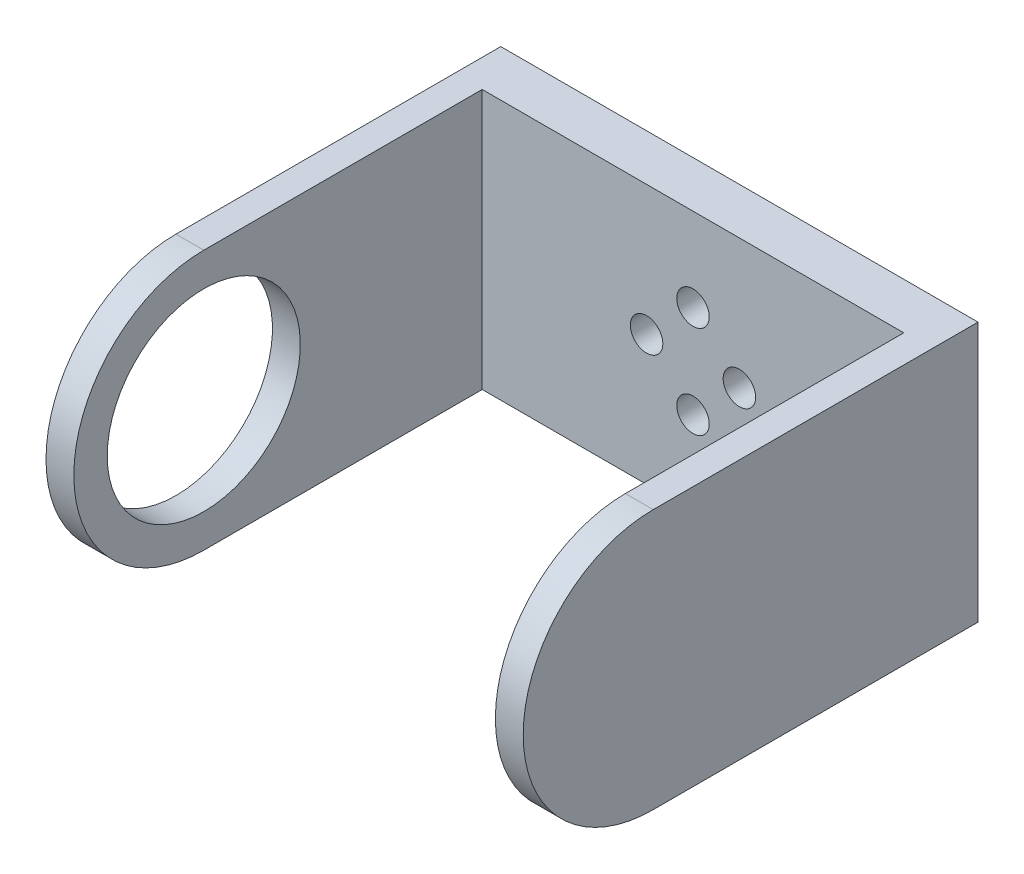
ISO-10303-21;
HEADER;
FILE_DESCRIPTION(('STEP AP214'),'2;1');
FILE_NAME('part.step','',(''),(''),'','','');
FILE_SCHEMA(('AUTOMOTIVE_DESIGN { 1 0 10303 214 1 1 1 1 }'));
ENDSEC;
DATA;
#1=APPLICATION_CONTEXT('core data for automotive mechanical design processes');
#2=APPLICATION_PROTOCOL_DEFINITION('international standard','automotive_design',2000,#1);
#3=PRODUCT_CONTEXT('',#1,'mechanical');
#4=PRODUCT('Part','Part','',(#3));
#5=PRODUCT_RELATED_PRODUCT_CATEGORY('part','',(#4));
#6=PRODUCT_DEFINITION_FORMATION('','',#4);
#7=PRODUCT_DEFINITION_CONTEXT('part definition',#1,'design');
#8=PRODUCT_DEFINITION('design','',#6,#7);
#9=PRODUCT_DEFINITION_SHAPE('','',#8);
#10=(LENGTH_UNIT() NAMED_UNIT(*) SI_UNIT(.MILLI.,.METRE.));
#11=(NAMED_UNIT(*) PLANE_ANGLE_UNIT() SI_UNIT($,.RADIAN.));
#12=(NAMED_UNIT(*) SI_UNIT($,.STERADIAN.) SOLID_ANGLE_UNIT());
#13=UNCERTAINTY_MEASURE_WITH_UNIT(LENGTH_MEASURE(1.E-05),#10,'distance_accuracy_value','');
#14=(GEOMETRIC_REPRESENTATION_CONTEXT(3) GLOBAL_UNCERTAINTY_ASSIGNED_CONTEXT((#13)) GLOBAL_UNIT_ASSIGNED_CONTEXT((#10,
#11,#12)) REPRESENTATION_CONTEXT('',''));
#15=CARTESIAN_POINT('',(0.,0.,0.));
#16=DIRECTION('',(0.,0.,1.));
#17=DIRECTION('',(1.,0.,0.));
#18=AXIS2_PLACEMENT_3D('',#15,#16,#17);
#19=CARTESIAN_POINT('',(25.71,14.,5.));
#20=DIRECTION('',(-1.,0.,0.));
#21=DIRECTION('',(0.,-1.,0.));
#22=AXIS2_PLACEMENT_3D('',#19,#20,#21);
#23=PLANE('',#22);
#24=DIRECTION('',(0.,1.,0.));
#25=VECTOR('',#24,1.);
#26=CARTESIAN_POINT('',(25.71,14.,0.));
#27=LINE('',#26,#25);
#28=CARTESIAN_POINT('',(25.71,-14.,0.));
#29=VERTEX_POINT('',#28);
#30=CARTESIAN_POINT('',(25.71,14.,0.));
#31=VERTEX_POINT('',#30);
#32=EDGE_CURVE('E127',#29,#31,#27,.T.);
#33=ORIENTED_EDGE('',*,*,#32,.T.);
#34=DIRECTION('',(0.,0.,-1.));
#35=VECTOR('',#34,1.);
#36=CARTESIAN_POINT('',(25.71,14.,5.));
#37=LINE('',#36,#35);
#38=CARTESIAN_POINT('',(25.71,14.,35.));
#39=VERTEX_POINT('',#38);
#40=EDGE_CURVE('E11',#39,#31,#37,.T.);
#41=ORIENTED_EDGE('',*,*,#40,.F.);
#42=CARTESIAN_POINT('',(25.71,0.,35.));
#43=DIRECTION('',(1.,0.,0.));
#44=DIRECTION('',(0.,1.,0.));
#45=AXIS2_PLACEMENT_3D('',#42,#43,#44);
#46=CIRCLE('',#45,14.);
#47=CARTESIAN_POINT('',(25.71,-14.,35.));
#48=VERTEX_POINT('',#47);
#49=EDGE_CURVE('E125',#39,#48,#46,.T.);
#50=ORIENTED_EDGE('',*,*,#49,.T.);
#51=DIRECTION('',(0.,0.,-1.));
#52=VECTOR('',#51,1.);
#53=CARTESIAN_POINT('',(25.71,-14.,5.));
#54=LINE('',#53,#52);
#55=EDGE_CURVE('E189',#48,#29,#54,.T.);
#56=ORIENTED_EDGE('',*,*,#55,.T.);
#57=EDGE_LOOP('',(#33,#41,#50,#56));
#58=FACE_BOUND('',#57,.T.);
#59=ADVANCED_FACE('F45',(#58),#23,.F.);
#60=CARTESIAN_POINT('',(-25.71,14.,5.));
#61=DIRECTION('',(0.,-1.,0.));
#62=DIRECTION('',(0.,0.,-1.));
#63=AXIS2_PLACEMENT_3D('',#60,#61,#62);
#64=PLANE('',#63);
#65=DIRECTION('',(-1.,0.,0.));
#66=VECTOR('',#65,1.);
#67=CARTESIAN_POINT('',(-25.71,14.,0.));
#68=LINE('',#67,#66);
#69=CARTESIAN_POINT('',(-25.71,14.,0.));
#70=VERTEX_POINT('',#69);
#71=EDGE_CURVE('E192',#31,#70,#68,.T.);
#72=ORIENTED_EDGE('',*,*,#71,.T.);
#73=DIRECTION('',(0.,0.,-1.));
#74=VECTOR('',#73,1.);
#75=CARTESIAN_POINT('',(-25.71,14.,5.));
#76=LINE('',#75,#74);
#77=CARTESIAN_POINT('',(-25.71,14.,35.));
#78=VERTEX_POINT('',#77);
#79=EDGE_CURVE('E54',#78,#70,#76,.T.);
#80=ORIENTED_EDGE('',*,*,#79,.F.);
#81=DIRECTION('',(-1.,0.,0.));
#82=VECTOR('',#81,1.);
#83=CARTESIAN_POINT('',(-22.71,14.,35.));
#84=LINE('',#83,#82);
#85=CARTESIAN_POINT('',(-22.71,14.,35.));
#86=VERTEX_POINT('',#85);
#87=EDGE_CURVE('E154',#86,#78,#84,.T.);
#88=ORIENTED_EDGE('',*,*,#87,.F.);
#89=DIRECTION('',(0.,0.,-1.));
#90=VECTOR('',#89,1.);
#91=CARTESIAN_POINT('',(-22.71,14.,35.));
#92=LINE('',#91,#90);
#93=CARTESIAN_POINT('',(-22.71,14.,5.));
#94=VERTEX_POINT('',#93);
#95=EDGE_CURVE('E162',#86,#94,#92,.T.);
#96=ORIENTED_EDGE('',*,*,#95,.T.);
#97=DIRECTION('',(-1.,0.,0.));
#98=VECTOR('',#97,1.);
#99=CARTESIAN_POINT('',(-25.71,14.,5.));
#100=LINE('',#99,#98);
#101=CARTESIAN_POINT('',(22.71,14.,5.));
#102=VERTEX_POINT('',#101);
#103=EDGE_CURVE('E182',#102,#94,#100,.T.);
#104=ORIENTED_EDGE('',*,*,#103,.F.);
#105=DIRECTION('',(0.,0.,-1.));
#106=VECTOR('',#105,1.);
#107=CARTESIAN_POINT('',(22.71,14.,35.));
#108=LINE('',#107,#106);
#109=CARTESIAN_POINT('',(22.71,14.,35.));
#110=VERTEX_POINT('',#109);
#111=EDGE_CURVE('E114',#110,#102,#108,.T.);
#112=ORIENTED_EDGE('',*,*,#111,.F.);
#113=DIRECTION('',(-1.,0.,0.));
#114=VECTOR('',#113,1.);
#115=CARTESIAN_POINT('',(22.71,14.,35.));
#116=LINE('',#115,#114);
#117=EDGE_CURVE('E109',#39,#110,#116,.T.);
#118=ORIENTED_EDGE('',*,*,#117,.F.);
#119=ORIENTED_EDGE('',*,*,#40,.T.);
#120=EDGE_LOOP('',(#72,#80,#88,#96,#104,#112,#118,#119));
#121=FACE_BOUND('',#120,.T.);
#122=ADVANCED_FACE('F111',(#121),#64,.F.);
#123=CARTESIAN_POINT('',(-25.71,14.,5.));
#124=DIRECTION('',(1.,0.,0.));
#125=DIRECTION('',(0.,0.,-1.));
#126=AXIS2_PLACEMENT_3D('',#123,#124,#125);
#127=PLANE('',#126);
#128=CARTESIAN_POINT('',(-25.71,0.,35.));
#129=DIRECTION('',(-1.,0.,0.));
#130=DIRECTION('',(0.,-1.,0.));
#131=AXIS2_PLACEMENT_3D('',#128,#129,#130);
#132=CIRCLE('',#131,10.4);
#133=CARTESIAN_POINT('',(-25.71,-10.4,35.));
#134=VERTEX_POINT('',#133);
#135=EDGE_CURVE('E137',#134,#134,#132,.T.);
#136=ORIENTED_EDGE('',*,*,#135,.F.);
#137=EDGE_LOOP('',(#136));
#138=FACE_BOUND('',#137,.T.);
#139=DIRECTION('',(0.,-1.,0.));
#140=VECTOR('',#139,1.);
#141=CARTESIAN_POINT('',(-25.71,14.,0.));
#142=LINE('',#141,#140);
#143=CARTESIAN_POINT('',(-25.71,-14.,0.));
#144=VERTEX_POINT('',#143);
#145=EDGE_CURVE('E195',#70,#144,#142,.T.);
#146=ORIENTED_EDGE('',*,*,#145,.T.);
#147=DIRECTION('',(0.,0.,-1.));
#148=VECTOR('',#147,1.);
#149=CARTESIAN_POINT('',(-25.71,-14.,5.));
#150=LINE('',#149,#148);
#151=CARTESIAN_POINT('',(-25.71,-14.,35.));
#152=VERTEX_POINT('',#151);
#153=EDGE_CURVE('E202',#152,#144,#150,.T.);
#154=ORIENTED_EDGE('',*,*,#153,.F.);
#155=CARTESIAN_POINT('',(-25.71,0.,35.));
#156=DIRECTION('',(-1.,0.,0.));
#157=DIRECTION('',(0.,1.,0.));
#158=AXIS2_PLACEMENT_3D('',#155,#156,#157);
#159=CIRCLE('',#158,14.);
#160=EDGE_CURVE('E150',#152,#78,#159,.T.);
#161=ORIENTED_EDGE('',*,*,#160,.T.);
#162=ORIENTED_EDGE('',*,*,#79,.T.);
#163=EDGE_LOOP('',(#146,#154,#161,#162));
#164=FACE_BOUND('',#163,.T.);
#165=ADVANCED_FACE('F210',(#138,#164),#127,.F.);
#166=CARTESIAN_POINT('',(-25.71,-14.,5.));
#167=DIRECTION('',(0.,1.,0.));
#168=DIRECTION('',(0.,0.,1.));
#169=AXIS2_PLACEMENT_3D('',#166,#167,#168);
#170=PLANE('',#169);
#171=DIRECTION('',(1.,0.,0.));
#172=VECTOR('',#171,1.);
#173=CARTESIAN_POINT('',(-25.71,-14.,0.));
#174=LINE('',#173,#172);
#175=EDGE_CURVE('E186',#144,#29,#174,.T.);
#176=ORIENTED_EDGE('',*,*,#175,.T.);
#177=ORIENTED_EDGE('',*,*,#55,.F.);
#178=DIRECTION('',(1.,0.,0.));
#179=VECTOR('',#178,1.);
#180=CARTESIAN_POINT('',(25.71,-14.,35.));
#181=LINE('',#180,#179);
#182=CARTESIAN_POINT('',(22.71,-14.,35.));
#183=VERTEX_POINT('',#182);
#184=EDGE_CURVE('E120',#183,#48,#181,.T.);
#185=ORIENTED_EDGE('',*,*,#184,.F.);
#186=DIRECTION('',(0.,0.,-1.));
#187=VECTOR('',#186,1.);
#188=CARTESIAN_POINT('',(22.71,-14.,35.));
#189=LINE('',#188,#187);
#190=CARTESIAN_POINT('',(22.71,-14.,5.));
#191=VERTEX_POINT('',#190);
#192=EDGE_CURVE('E174',#183,#191,#189,.T.);
#193=ORIENTED_EDGE('',*,*,#192,.T.);
#194=DIRECTION('',(1.,0.,0.));
#195=VECTOR('',#194,1.);
#196=CARTESIAN_POINT('',(-25.71,-14.,5.));
#197=LINE('',#196,#195);
#198=CARTESIAN_POINT('',(-22.71,-14.,5.));
#199=VERTEX_POINT('',#198);
#200=EDGE_CURVE('E185',#199,#191,#197,.T.);
#201=ORIENTED_EDGE('',*,*,#200,.F.);
#202=DIRECTION('',(0.,0.,-1.));
#203=VECTOR('',#202,1.);
#204=CARTESIAN_POINT('',(-22.71,-14.,35.));
#205=LINE('',#204,#203);
#206=CARTESIAN_POINT('',(-22.71,-14.,35.));
#207=VERTEX_POINT('',#206);
#208=EDGE_CURVE('E168',#207,#199,#205,.T.);
#209=ORIENTED_EDGE('',*,*,#208,.F.);
#210=DIRECTION('',(1.,0.,0.));
#211=VECTOR('',#210,1.);
#212=CARTESIAN_POINT('',(-25.71,-14.,35.));
#213=LINE('',#212,#211);
#214=EDGE_CURVE('E158',#152,#207,#213,.T.);
#215=ORIENTED_EDGE('',*,*,#214,.F.);
#216=ORIENTED_EDGE('',*,*,#153,.T.);
#217=EDGE_LOOP('',(#176,#177,#185,#193,#201,#209,#215,#216));
#218=FACE_BOUND('',#217,.T.);
#219=ADVANCED_FACE('F218',(#218),#170,.F.);
#220=CARTESIAN_POINT('',(0.,0.,5.));
#221=DIRECTION('',(0.,0.,1.));
#222=DIRECTION('',(1.,0.,0.));
#223=AXIS2_PLACEMENT_3D('',#220,#221,#222);
#224=PLANE('',#223);
#225=CARTESIAN_POINT('',(0.,5.,5.));
#226=DIRECTION('',(0.,0.,1.));
#227=DIRECTION('',(1.,0.,0.));
#228=AXIS2_PLACEMENT_3D('',#225,#226,#227);
#229=CIRCLE('',#228,1.75);
#230=CARTESIAN_POINT('',(1.75,5.,5.));
#231=VERTEX_POINT('',#230);
#232=EDGE_CURVE('E133',#231,#231,#229,.T.);
#233=ORIENTED_EDGE('',*,*,#232,.F.);
#234=EDGE_LOOP('',(#233));
#235=FACE_BOUND('',#234,.T.);
#236=CARTESIAN_POINT('',(5.,0.,5.));
#237=DIRECTION('',(0.,0.,1.));
#238=DIRECTION('',(1.,0.,0.));
#239=AXIS2_PLACEMENT_3D('',#236,#237,#238);
#240=CIRCLE('',#239,1.75);
#241=CARTESIAN_POINT('',(6.75,0.,5.));
#242=VERTEX_POINT('',#241);
#243=EDGE_CURVE('E140',#242,#242,#240,.T.);
#244=ORIENTED_EDGE('',*,*,#243,.F.);
#245=EDGE_LOOP('',(#244));
#246=FACE_BOUND('',#245,.T.);
#247=CARTESIAN_POINT('',(-5.,0.,5.));
#248=DIRECTION('',(0.,0.,1.));
#249=DIRECTION('',(1.,0.,0.));
#250=AXIS2_PLACEMENT_3D('',#247,#248,#249);
#251=CIRCLE('',#250,1.75);
#252=CARTESIAN_POINT('',(-3.25,0.,5.));
#253=VERTEX_POINT('',#252);
#254=EDGE_CURVE('E263',#253,#253,#251,.T.);
#255=ORIENTED_EDGE('',*,*,#254,.F.);
#256=EDGE_LOOP('',(#255));
#257=FACE_BOUND('',#256,.T.);
#258=CARTESIAN_POINT('',(0.,-5.,5.));
#259=DIRECTION('',(0.,0.,1.));
#260=DIRECTION('',(1.,0.,0.));
#261=AXIS2_PLACEMENT_3D('',#258,#259,#260);
#262=CIRCLE('',#261,1.75);
#263=CARTESIAN_POINT('',(1.75,-5.,5.));
#264=VERTEX_POINT('',#263);
#265=EDGE_CURVE('E266',#264,#264,#262,.T.);
#266=ORIENTED_EDGE('',*,*,#265,.F.);
#267=EDGE_LOOP('',(#266));
#268=FACE_BOUND('',#267,.T.);
#269=DIRECTION('',(0.,1.,0.));
#270=VECTOR('',#269,1.);
#271=CARTESIAN_POINT('',(-22.71,-14.,5.));
#272=LINE('',#271,#270);
#273=EDGE_CURVE('E61',#199,#94,#272,.T.);
#274=ORIENTED_EDGE('',*,*,#273,.F.);
#275=ORIENTED_EDGE('',*,*,#200,.T.);
#276=DIRECTION('',(0.,-1.,0.));
#277=VECTOR('',#276,1.);
#278=CARTESIAN_POINT('',(22.71,-14.,5.));
#279=LINE('',#278,#277);
#280=EDGE_CURVE('E66',#102,#191,#279,.T.);
#281=ORIENTED_EDGE('',*,*,#280,.F.);
#282=ORIENTED_EDGE('',*,*,#103,.T.);
#283=EDGE_LOOP('',(#274,#275,#281,#282));
#284=FACE_BOUND('',#283,.T.);
#285=ADVANCED_FACE('F224',(#235,#246,#257,#268,#284),#224,.T.);
#286=CARTESIAN_POINT('',(0.,0.,0.));
#287=DIRECTION('',(0.,0.,1.));
#288=DIRECTION('',(1.,0.,0.));
#289=AXIS2_PLACEMENT_3D('',#286,#287,#288);
#290=PLANE('',#289);
#291=CARTESIAN_POINT('',(0.,5.,0.));
#292=DIRECTION('',(0.,0.,-1.));
#293=DIRECTION('',(-1.,0.,0.));
#294=AXIS2_PLACEMENT_3D('',#291,#292,#293);
#295=CIRCLE('',#294,1.75);
#296=CARTESIAN_POINT('',(-1.75,5.,0.));
#297=VERTEX_POINT('',#296);
#298=EDGE_CURVE('E269',#297,#297,#295,.T.);
#299=ORIENTED_EDGE('',*,*,#298,.F.);
#300=EDGE_LOOP('',(#299));
#301=FACE_BOUND('',#300,.T.);
#302=CARTESIAN_POINT('',(5.,0.,0.));
#303=DIRECTION('',(0.,0.,-1.));
#304=DIRECTION('',(-1.,0.,0.));
#305=AXIS2_PLACEMENT_3D('',#302,#303,#304);
#306=CIRCLE('',#305,1.75);
#307=CARTESIAN_POINT('',(3.25,0.,0.));
#308=VERTEX_POINT('',#307);
#309=EDGE_CURVE('E275',#308,#308,#306,.T.);
#310=ORIENTED_EDGE('',*,*,#309,.F.);
#311=EDGE_LOOP('',(#310));
#312=FACE_BOUND('',#311,.T.);
#313=CARTESIAN_POINT('',(-5.,0.,0.));
#314=DIRECTION('',(0.,0.,-1.));
#315=DIRECTION('',(1.,0.,0.));
#316=AXIS2_PLACEMENT_3D('',#313,#314,#315);
#317=CIRCLE('',#316,1.75);
#318=CARTESIAN_POINT('',(-3.25,0.,0.));
#319=VERTEX_POINT('',#318);
#320=EDGE_CURVE('E293',#319,#319,#317,.T.);
#321=ORIENTED_EDGE('',*,*,#320,.F.);
#322=EDGE_LOOP('',(#321));
#323=FACE_BOUND('',#322,.T.);
#324=CARTESIAN_POINT('',(0.,-5.,0.));
#325=DIRECTION('',(0.,0.,-1.));
#326=DIRECTION('',(1.,0.,0.));
#327=AXIS2_PLACEMENT_3D('',#324,#325,#326);
#328=CIRCLE('',#327,1.75);
#329=CARTESIAN_POINT('',(1.75,-5.,0.));
#330=VERTEX_POINT('',#329);
#331=EDGE_CURVE('E278',#330,#330,#328,.T.);
#332=ORIENTED_EDGE('',*,*,#331,.F.);
#333=EDGE_LOOP('',(#332));
#334=FACE_BOUND('',#333,.T.);
#335=ORIENTED_EDGE('',*,*,#32,.F.);
#336=ORIENTED_EDGE('',*,*,#175,.F.);
#337=ORIENTED_EDGE('',*,*,#145,.F.);
#338=ORIENTED_EDGE('',*,*,#71,.F.);
#339=EDGE_LOOP('',(#335,#336,#337,#338));
#340=FACE_BOUND('',#339,.T.);
#341=ADVANCED_FACE('F216',(#301,#312,#323,#334,#340),#290,.F.);
#342=CARTESIAN_POINT('',(22.71,-14.,35.));
#343=DIRECTION('',(1.,0.,0.));
#344=DIRECTION('',(0.,0.,-1.));
#345=AXIS2_PLACEMENT_3D('',#342,#343,#344);
#346=PLANE('',#345);
#347=ORIENTED_EDGE('',*,*,#280,.T.);
#348=ORIENTED_EDGE('',*,*,#192,.F.);
#349=CARTESIAN_POINT('',(22.71,0.,35.));
#350=DIRECTION('',(1.,0.,0.));
#351=DIRECTION('',(0.,1.,0.));
#352=AXIS2_PLACEMENT_3D('',#349,#350,#351);
#353=CIRCLE('',#352,14.);
#354=EDGE_CURVE('E132',#110,#183,#353,.T.);
#355=ORIENTED_EDGE('',*,*,#354,.F.);
#356=ORIENTED_EDGE('',*,*,#111,.T.);
#357=EDGE_LOOP('',(#347,#348,#355,#356));
#358=FACE_BOUND('',#357,.T.);
#359=ADVANCED_FACE('F226',(#358),#346,.F.);
#360=CARTESIAN_POINT('',(-22.71,-14.,35.));
#361=DIRECTION('',(-1.,0.,0.));
#362=DIRECTION('',(0.,0.,1.));
#363=AXIS2_PLACEMENT_3D('',#360,#361,#362);
#364=PLANE('',#363);
#365=CARTESIAN_POINT('',(-22.71,0.,35.));
#366=DIRECTION('',(-1.,0.,0.));
#367=DIRECTION('',(0.,0.,1.));
#368=AXIS2_PLACEMENT_3D('',#365,#366,#367);
#369=CIRCLE('',#368,10.4);
#370=CARTESIAN_POINT('',(-22.71,0.,45.4));
#371=VERTEX_POINT('',#370);
#372=EDGE_CURVE('E48',#371,#371,#369,.T.);
#373=ORIENTED_EDGE('',*,*,#372,.T.);
#374=EDGE_LOOP('',(#373));
#375=FACE_BOUND('',#374,.T.);
#376=ORIENTED_EDGE('',*,*,#273,.T.);
#377=ORIENTED_EDGE('',*,*,#95,.F.);
#378=CARTESIAN_POINT('',(-22.71,0.,35.));
#379=DIRECTION('',(-1.,0.,0.));
#380=DIRECTION('',(0.,1.,0.));
#381=AXIS2_PLACEMENT_3D('',#378,#379,#380);
#382=CIRCLE('',#381,14.);
#383=EDGE_CURVE('E146',#207,#86,#382,.T.);
#384=ORIENTED_EDGE('',*,*,#383,.F.);
#385=ORIENTED_EDGE('',*,*,#208,.T.);
#386=EDGE_LOOP('',(#376,#377,#384,#385));
#387=FACE_BOUND('',#386,.T.);
#388=ADVANCED_FACE('F223',(#375,#387),#364,.F.);
#389=CARTESIAN_POINT('',(-22.71,0.,35.));
#390=DIRECTION('',(-1.,0.,0.));
#391=DIRECTION('',(0.,-1.,0.));
#392=AXIS2_PLACEMENT_3D('',#389,#390,#391);
#393=CYLINDRICAL_SURFACE('',#392,14.);
#394=ORIENTED_EDGE('',*,*,#160,.F.);
#395=ORIENTED_EDGE('',*,*,#214,.T.);
#396=ORIENTED_EDGE('',*,*,#383,.T.);
#397=ORIENTED_EDGE('',*,*,#87,.T.);
#398=EDGE_LOOP('',(#394,#395,#396,#397));
#399=FACE_BOUND('',#398,.T.);
#400=ADVANCED_FACE('F220',(#399),#393,.T.);
#401=CARTESIAN_POINT('',(-21.71,0.,35.));
#402=DIRECTION('',(-1.,0.,0.));
#403=DIRECTION('',(0.,-1.,0.));
#404=AXIS2_PLACEMENT_3D('',#401,#402,#403);
#405=CYLINDRICAL_SURFACE('',#404,10.4);
#406=ORIENTED_EDGE('',*,*,#135,.T.);
#407=EDGE_LOOP('',(#406));
#408=FACE_BOUND('',#407,.T.);
#409=ORIENTED_EDGE('',*,*,#372,.F.);
#410=EDGE_LOOP('',(#409));
#411=FACE_BOUND('',#410,.T.);
#412=ADVANCED_FACE('F312',(#408,#411),#405,.F.);
#413=CARTESIAN_POINT('',(22.71,0.,35.));
#414=DIRECTION('',(1.,0.,0.));
#415=DIRECTION('',(0.,1.,0.));
#416=AXIS2_PLACEMENT_3D('',#413,#414,#415);
#417=CYLINDRICAL_SURFACE('',#416,14.);
#418=ORIENTED_EDGE('',*,*,#49,.F.);
#419=ORIENTED_EDGE('',*,*,#117,.T.);
#420=ORIENTED_EDGE('',*,*,#354,.T.);
#421=ORIENTED_EDGE('',*,*,#184,.T.);
#422=EDGE_LOOP('',(#418,#419,#420,#421));
#423=FACE_BOUND('',#422,.T.);
#424=ADVANCED_FACE('F129',(#423),#417,.T.);
#425=CARTESIAN_POINT('',(0.,-5.,10.));
#426=DIRECTION('',(0.,0.,-1.));
#427=DIRECTION('',(-1.,0.,0.));
#428=AXIS2_PLACEMENT_3D('',#425,#426,#427);
#429=CYLINDRICAL_SURFACE('',#428,1.75);
#430=ORIENTED_EDGE('',*,*,#265,.T.);
#431=EDGE_LOOP('',(#430));
#432=FACE_BOUND('',#431,.T.);
#433=ORIENTED_EDGE('',*,*,#331,.T.);
#434=EDGE_LOOP('',(#433));
#435=FACE_BOUND('',#434,.T.);
#436=ADVANCED_FACE('F303',(#432,#435),#429,.F.);
#437=CARTESIAN_POINT('',(-5.,0.,10.));
#438=DIRECTION('',(0.,0.,-1.));
#439=DIRECTION('',(-1.,0.,0.));
#440=AXIS2_PLACEMENT_3D('',#437,#438,#439);
#441=CYLINDRICAL_SURFACE('',#440,1.75);
#442=ORIENTED_EDGE('',*,*,#254,.T.);
#443=EDGE_LOOP('',(#442));
#444=FACE_BOUND('',#443,.T.);
#445=ORIENTED_EDGE('',*,*,#320,.T.);
#446=EDGE_LOOP('',(#445));
#447=FACE_BOUND('',#446,.T.);
#448=ADVANCED_FACE('F287',(#444,#447),#441,.F.);
#449=CARTESIAN_POINT('',(5.,0.,10.));
#450=DIRECTION('',(0.,0.,-1.));
#451=DIRECTION('',(-1.,0.,0.));
#452=AXIS2_PLACEMENT_3D('',#449,#450,#451);
#453=CYLINDRICAL_SURFACE('',#452,1.75);
#454=ORIENTED_EDGE('',*,*,#243,.T.);
#455=EDGE_LOOP('',(#454));
#456=FACE_BOUND('',#455,.T.);
#457=ORIENTED_EDGE('',*,*,#309,.T.);
#458=EDGE_LOOP('',(#457));
#459=FACE_BOUND('',#458,.T.);
#460=ADVANCED_FACE('F283',(#456,#459),#453,.F.);
#461=CARTESIAN_POINT('',(0.,5.,10.));
#462=DIRECTION('',(0.,0.,-1.));
#463=DIRECTION('',(-1.,0.,0.));
#464=AXIS2_PLACEMENT_3D('',#461,#462,#463);
#465=CYLINDRICAL_SURFACE('',#464,1.75);
#466=ORIENTED_EDGE('',*,*,#232,.T.);
#467=EDGE_LOOP('',(#466));
#468=FACE_BOUND('',#467,.T.);
#469=ORIENTED_EDGE('',*,*,#298,.T.);
#470=EDGE_LOOP('',(#469));
#471=FACE_BOUND('',#470,.T.);
#472=ADVANCED_FACE('F286',(#468,#471),#465,.F.);
#473=CLOSED_SHELL('',(#59,#122,#165,#219,#285,#341,#359,#388,#400,#412,#424,#436,#448,#460,#472));
#474=MANIFOLD_SOLID_BREP('B2',#473);
#475=ADVANCED_BREP_SHAPE_REPRESENTATION('',(#18,#474),#14);
#476=SHAPE_DEFINITION_REPRESENTATION(#9,#475);
ENDSEC;
END-ISO-10303-21;
